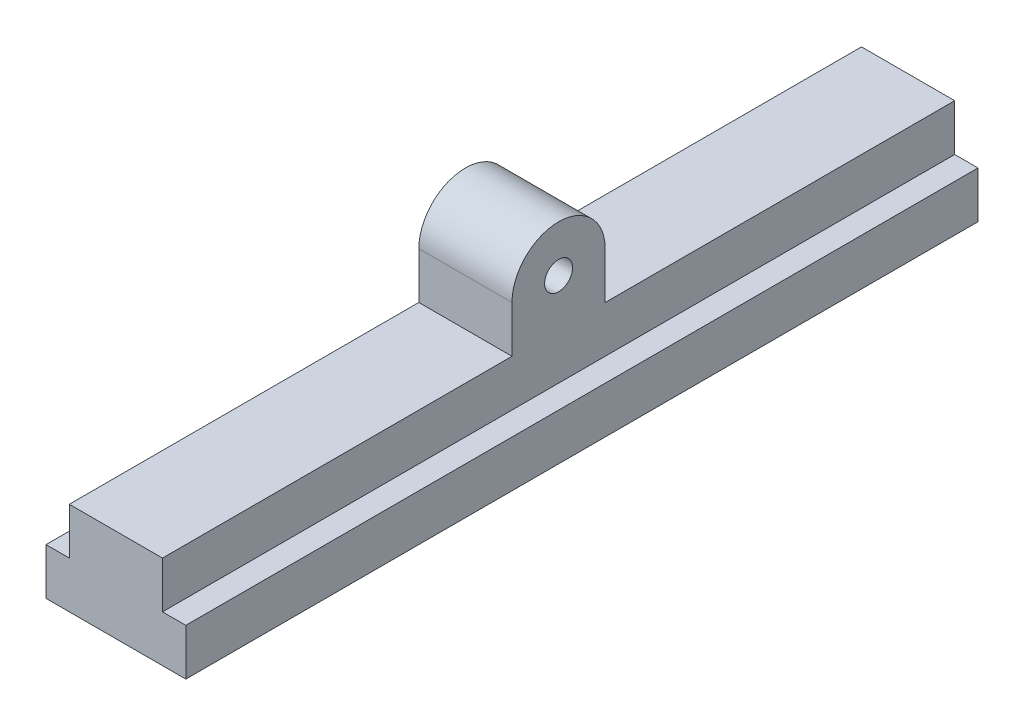
ISO-10303-21;
HEADER;
FILE_DESCRIPTION(('STEP AP214'),'2;1');
FILE_NAME('part.step','',(''),(''),'','','');
FILE_SCHEMA(('AUTOMOTIVE_DESIGN { 1 0 10303 214 1 1 1 1 }'));
ENDSEC;
DATA;
#1=APPLICATION_CONTEXT('core data for automotive mechanical design processes');
#2=APPLICATION_PROTOCOL_DEFINITION('international standard','automotive_design',2000,#1);
#3=PRODUCT_CONTEXT('',#1,'mechanical');
#4=PRODUCT('Part','Part','',(#3));
#5=PRODUCT_RELATED_PRODUCT_CATEGORY('part','',(#4));
#6=PRODUCT_DEFINITION_FORMATION('','',#4);
#7=PRODUCT_DEFINITION_CONTEXT('part definition',#1,'design');
#8=PRODUCT_DEFINITION('design','',#6,#7);
#9=PRODUCT_DEFINITION_SHAPE('','',#8);
#10=(LENGTH_UNIT() NAMED_UNIT(*) SI_UNIT(.MILLI.,.METRE.));
#11=(NAMED_UNIT(*) PLANE_ANGLE_UNIT() SI_UNIT($,.RADIAN.));
#12=(NAMED_UNIT(*) SI_UNIT($,.STERADIAN.) SOLID_ANGLE_UNIT());
#13=UNCERTAINTY_MEASURE_WITH_UNIT(LENGTH_MEASURE(1.E-05),#10,'distance_accuracy_value','');
#14=(GEOMETRIC_REPRESENTATION_CONTEXT(3) GLOBAL_UNCERTAINTY_ASSIGNED_CONTEXT((#13)) GLOBAL_UNIT_ASSIGNED_CONTEXT((#10,
#11,#12)) REPRESENTATION_CONTEXT('',''));
#15=CARTESIAN_POINT('',(0.,0.,0.));
#16=DIRECTION('',(0.,0.,1.));
#17=DIRECTION('',(1.,0.,0.));
#18=AXIS2_PLACEMENT_3D('',#15,#16,#17);
#19=CARTESIAN_POINT('',(-0.0130452574129527,8.13399626442955,240.));
#20=DIRECTION('',(0.,-1.,0.));
#21=DIRECTION('',(0.,0.,-1.));
#22=AXIS2_PLACEMENT_3D('',#19,#20,#21);
#23=PLANE('',#22);
#24=DIRECTION('',(1.,0.,0.));
#25=VECTOR('',#24,1.);
#26=CARTESIAN_POINT('',(-0.0130452574129448,8.13399626442955,165.));
#27=LINE('',#26,#25);
#28=CARTESIAN_POINT('',(-0.0130452574129448,8.13399626442955,165.));
#29=VERTEX_POINT('',#28);
#30=CARTESIAN_POINT('',(19.986954742587,8.13399626442955,165.));
#31=VERTEX_POINT('',#30);
#32=EDGE_CURVE('E159',#29,#31,#27,.T.);
#33=ORIENTED_EDGE('',*,*,#32,.F.);
#34=DIRECTION('',(0.,0.,-1.));
#35=VECTOR('',#34,1.);
#36=CARTESIAN_POINT('',(-0.0130452574129527,8.13399626442955,240.));
#37=LINE('',#36,#35);
#38=CARTESIAN_POINT('',(-0.0130452574129527,8.13399626442955,240.));
#39=VERTEX_POINT('',#38);
#40=EDGE_CURVE('E146',#39,#29,#37,.T.);
#41=ORIENTED_EDGE('',*,*,#40,.F.);
#42=DIRECTION('',(-1.,0.,0.));
#43=VECTOR('',#42,1.);
#44=CARTESIAN_POINT('',(-0.0130452574129527,8.13399626442955,240.));
#45=LINE('',#44,#43);
#46=CARTESIAN_POINT('',(19.986954742587,8.13399626442955,240.));
#47=VERTEX_POINT('',#46);
#48=EDGE_CURVE('E209',#47,#39,#45,.T.);
#49=ORIENTED_EDGE('',*,*,#48,.F.);
#50=DIRECTION('',(0.,0.,-1.));
#51=VECTOR('',#50,1.);
#52=CARTESIAN_POINT('',(19.986954742587,8.13399626442955,240.));
#53=LINE('',#52,#51);
#54=EDGE_CURVE('E234',#47,#31,#53,.T.);
#55=ORIENTED_EDGE('',*,*,#54,.T.);
#56=EDGE_LOOP('',(#33,#41,#49,#55));
#57=FACE_BOUND('',#56,.T.);
#58=ADVANCED_FACE('F47',(#57),#23,.F.);
#59=CARTESIAN_POINT('',(24.986954742587,-1.86600373557045,240.));
#60=DIRECTION('',(-1.,0.,0.));
#61=DIRECTION('',(0.,0.,1.));
#62=AXIS2_PLACEMENT_3D('',#59,#60,#61);
#63=PLANE('',#62);
#64=DIRECTION('',(0.,0.,-1.));
#65=VECTOR('',#64,1.);
#66=CARTESIAN_POINT('',(24.986954742587,-11.8660037355704,240.));
#67=LINE('',#66,#65);
#68=CARTESIAN_POINT('',(24.986954742587,-11.8660037355704,240.));
#69=VERTEX_POINT('',#68);
#70=CARTESIAN_POINT('',(24.986954742587,-11.8660037355704,70.));
#71=VERTEX_POINT('',#70);
#72=EDGE_CURVE('E219',#69,#71,#67,.T.);
#73=ORIENTED_EDGE('',*,*,#72,.T.);
#74=DIRECTION('',(0.,-1.,0.));
#75=VECTOR('',#74,1.);
#76=CARTESIAN_POINT('',(24.986954742587,48.1339962644296,70.));
#77=LINE('',#76,#75);
#78=CARTESIAN_POINT('',(24.986954742587,-1.86600373557044,70.));
#79=VERTEX_POINT('',#78);
#80=EDGE_CURVE('E70',#79,#71,#77,.T.);
#81=ORIENTED_EDGE('',*,*,#80,.F.);
#82=DIRECTION('',(0.,0.,-1.));
#83=VECTOR('',#82,1.);
#84=CARTESIAN_POINT('',(24.986954742587,-1.86600373557045,240.));
#85=LINE('',#84,#83);
#86=CARTESIAN_POINT('',(24.986954742587,-1.86600373557045,240.));
#87=VERTEX_POINT('',#86);
#88=EDGE_CURVE('E11',#87,#79,#85,.T.);
#89=ORIENTED_EDGE('',*,*,#88,.F.);
#90=DIRECTION('',(0.,1.,0.));
#91=VECTOR('',#90,1.);
#92=CARTESIAN_POINT('',(24.986954742587,-1.86600373557045,240.));
#93=LINE('',#92,#91);
#94=EDGE_CURVE('E202',#69,#87,#93,.T.);
#95=ORIENTED_EDGE('',*,*,#94,.F.);
#96=EDGE_LOOP('',(#73,#81,#89,#95));
#97=FACE_BOUND('',#96,.T.);
#98=ADVANCED_FACE('F49',(#97),#63,.F.);
#99=CARTESIAN_POINT('',(19.986954742587,-1.86600373557045,240.));
#100=DIRECTION('',(0.,-1.,0.));
#101=DIRECTION('',(0.,0.,-1.));
#102=AXIS2_PLACEMENT_3D('',#99,#100,#101);
#103=PLANE('',#102);
#104=ORIENTED_EDGE('',*,*,#88,.T.);
#105=DIRECTION('',(-1.,0.,0.));
#106=VECTOR('',#105,1.);
#107=CARTESIAN_POINT('',(19.986954742587,-1.86600373557045,70.));
#108=LINE('',#107,#106);
#109=CARTESIAN_POINT('',(19.986954742587,-1.86600373557045,70.));
#110=VERTEX_POINT('',#109);
#111=EDGE_CURVE('E199',#79,#110,#108,.T.);
#112=ORIENTED_EDGE('',*,*,#111,.T.);
#113=DIRECTION('',(0.,0.,-1.));
#114=VECTOR('',#113,1.);
#115=CARTESIAN_POINT('',(19.986954742587,-1.86600373557045,240.));
#116=LINE('',#115,#114);
#117=CARTESIAN_POINT('',(19.986954742587,-1.86600373557045,240.));
#118=VERTEX_POINT('',#117);
#119=EDGE_CURVE('E55',#118,#110,#116,.T.);
#120=ORIENTED_EDGE('',*,*,#119,.F.);
#121=DIRECTION('',(-1.,0.,0.));
#122=VECTOR('',#121,1.);
#123=CARTESIAN_POINT('',(19.986954742587,-1.86600373557045,240.));
#124=LINE('',#123,#122);
#125=EDGE_CURVE('E205',#87,#118,#124,.T.);
#126=ORIENTED_EDGE('',*,*,#125,.F.);
#127=EDGE_LOOP('',(#104,#112,#120,#126));
#128=FACE_BOUND('',#127,.T.);
#129=ADVANCED_FACE('F245',(#128),#103,.F.);
#130=CARTESIAN_POINT('',(19.986954742587,8.13399626442955,240.));
#131=DIRECTION('',(-1.,0.,0.));
#132=DIRECTION('',(0.,0.,1.));
#133=AXIS2_PLACEMENT_3D('',#130,#131,#132);
#134=PLANE('',#133);
#135=ORIENTED_EDGE('',*,*,#119,.T.);
#136=DIRECTION('',(0.,1.,0.));
#137=VECTOR('',#136,1.);
#138=CARTESIAN_POINT('',(19.986954742587,8.13399626442955,70.));
#139=LINE('',#138,#137);
#140=CARTESIAN_POINT('',(19.986954742587,8.13399626442955,70.));
#141=VERTEX_POINT('',#140);
#142=EDGE_CURVE('E196',#110,#141,#139,.T.);
#143=ORIENTED_EDGE('',*,*,#142,.T.);
#144=CARTESIAN_POINT('',(19.986954742587,8.13399626442955,145.));
#145=VERTEX_POINT('',#144);
#146=EDGE_CURVE('E233',#145,#141,#53,.T.);
#147=ORIENTED_EDGE('',*,*,#146,.F.);
#148=DIRECTION('',(0.,1.,0.));
#149=VECTOR('',#148,1.);
#150=CARTESIAN_POINT('',(19.986954742587,0.,145.));
#151=LINE('',#150,#149);
#152=CARTESIAN_POINT('',(19.986954742587,18.1339962644295,145.));
#153=VERTEX_POINT('',#152);
#154=EDGE_CURVE('E62',#145,#153,#151,.T.);
#155=ORIENTED_EDGE('',*,*,#154,.T.);
#156=CARTESIAN_POINT('',(19.986954742587,18.1339962644295,155.));
#157=DIRECTION('',(1.,0.,0.));
#158=DIRECTION('',(0.,0.,-1.));
#159=AXIS2_PLACEMENT_3D('',#156,#157,#158);
#160=CIRCLE('',#159,9.99999999999998);
#161=CARTESIAN_POINT('',(19.986954742587,18.1339962644296,165.));
#162=VERTEX_POINT('',#161);
#163=EDGE_CURVE('E173',#153,#162,#160,.T.);
#164=ORIENTED_EDGE('',*,*,#163,.T.);
#165=DIRECTION('',(0.,1.,0.));
#166=VECTOR('',#165,1.);
#167=CARTESIAN_POINT('',(19.986954742587,0.,165.));
#168=LINE('',#167,#166);
#169=EDGE_CURVE('E155',#31,#162,#168,.T.);
#170=ORIENTED_EDGE('',*,*,#169,.F.);
#171=ORIENTED_EDGE('',*,*,#54,.F.);
#172=DIRECTION('',(0.,1.,0.));
#173=VECTOR('',#172,1.);
#174=CARTESIAN_POINT('',(19.986954742587,8.13399626442955,240.));
#175=LINE('',#174,#173);
#176=EDGE_CURVE('E207',#118,#47,#175,.T.);
#177=ORIENTED_EDGE('',*,*,#176,.F.);
#178=EDGE_LOOP('',(#135,#143,#147,#155,#164,#170,#171,#177));
#179=FACE_BOUND('',#178,.T.);
#180=CARTESIAN_POINT('',(19.986954742587,18.1339962644295,155.));
#181=DIRECTION('',(1.,0.,0.));
#182=DIRECTION('',(0.,0.,-1.));
#183=AXIS2_PLACEMENT_3D('',#180,#181,#182);
#184=CIRCLE('',#183,2.99999999999999);
#185=CARTESIAN_POINT('',(19.986954742587,18.1339962644295,152.));
#186=VERTEX_POINT('',#185);
#187=EDGE_CURVE('E164',#186,#186,#184,.T.);
#188=ORIENTED_EDGE('',*,*,#187,.F.);
#189=EDGE_LOOP('',(#188));
#190=FACE_BOUND('',#189,.T.);
#191=ADVANCED_FACE('F240',(#179,#190),#134,.F.);
#192=CARTESIAN_POINT('',(-0.0130452574129448,8.13399626442955,145.));
#193=VERTEX_POINT('',#192);
#194=CARTESIAN_POINT('',(-0.0130452574129527,8.13399626442955,70.));
#195=VERTEX_POINT('',#194);
#196=EDGE_CURVE('E231',#193,#195,#37,.T.);
#197=ORIENTED_EDGE('',*,*,#196,.F.);
#198=DIRECTION('',(1.,0.,0.));
#199=VECTOR('',#198,1.);
#200=CARTESIAN_POINT('',(-0.0130452574129448,8.13399626442955,145.));
#201=LINE('',#200,#199);
#202=EDGE_CURVE('E179',#193,#145,#201,.T.);
#203=ORIENTED_EDGE('',*,*,#202,.T.);
#204=ORIENTED_EDGE('',*,*,#146,.T.);
#205=DIRECTION('',(-1.,0.,0.));
#206=VECTOR('',#205,1.);
#207=CARTESIAN_POINT('',(-0.0130452574129527,8.13399626442955,70.));
#208=LINE('',#207,#206);
#209=EDGE_CURVE('E193',#141,#195,#208,.T.);
#210=ORIENTED_EDGE('',*,*,#209,.T.);
#211=EDGE_LOOP('',(#197,#203,#204,#210));
#212=FACE_BOUND('',#211,.T.);
#213=ADVANCED_FACE('F267',(#212),#23,.F.);
#214=CARTESIAN_POINT('',(-0.0130452574129527,-1.86600373557045,240.));
#215=DIRECTION('',(1.,0.,0.));
#216=DIRECTION('',(0.,0.,-1.));
#217=AXIS2_PLACEMENT_3D('',#214,#215,#216);
#218=PLANE('',#217);
#219=ORIENTED_EDGE('',*,*,#40,.T.);
#220=DIRECTION('',(0.,1.,0.));
#221=VECTOR('',#220,1.);
#222=CARTESIAN_POINT('',(-0.0130452574129448,0.,165.));
#223=LINE('',#222,#221);
#224=CARTESIAN_POINT('',(-0.0130452574129448,18.1339962644296,165.));
#225=VERTEX_POINT('',#224);
#226=EDGE_CURVE('E136',#29,#225,#223,.T.);
#227=ORIENTED_EDGE('',*,*,#226,.T.);
#228=CARTESIAN_POINT('',(-0.0130452574129448,18.1339962644295,155.));
#229=DIRECTION('',(1.,0.,0.));
#230=DIRECTION('',(0.,0.,-1.));
#231=AXIS2_PLACEMENT_3D('',#228,#229,#230);
#232=CIRCLE('',#231,9.99999999999998);
#233=CARTESIAN_POINT('',(-0.0130452574129448,18.1339962644295,145.));
#234=VERTEX_POINT('',#233);
#235=EDGE_CURVE('E142',#234,#225,#232,.T.);
#236=ORIENTED_EDGE('',*,*,#235,.F.);
#237=DIRECTION('',(0.,1.,0.));
#238=VECTOR('',#237,1.);
#239=CARTESIAN_POINT('',(-0.0130452574129448,0.,145.));
#240=LINE('',#239,#238);
#241=EDGE_CURVE('E149',#193,#234,#240,.T.);
#242=ORIENTED_EDGE('',*,*,#241,.F.);
#243=ORIENTED_EDGE('',*,*,#196,.T.);
#244=DIRECTION('',(0.,-1.,0.));
#245=VECTOR('',#244,1.);
#246=CARTESIAN_POINT('',(-0.0130452574129527,-1.86600373557045,70.));
#247=LINE('',#246,#245);
#248=CARTESIAN_POINT('',(-0.0130452574129527,-1.86600373557045,70.));
#249=VERTEX_POINT('',#248);
#250=EDGE_CURVE('E190',#195,#249,#247,.T.);
#251=ORIENTED_EDGE('',*,*,#250,.T.);
#252=DIRECTION('',(0.,0.,-1.));
#253=VECTOR('',#252,1.);
#254=CARTESIAN_POINT('',(-0.0130452574129527,-1.86600373557045,240.));
#255=LINE('',#254,#253);
#256=CARTESIAN_POINT('',(-0.0130452574129527,-1.86600373557045,240.));
#257=VERTEX_POINT('',#256);
#258=EDGE_CURVE('E228',#257,#249,#255,.T.);
#259=ORIENTED_EDGE('',*,*,#258,.F.);
#260=DIRECTION('',(0.,-1.,0.));
#261=VECTOR('',#260,1.);
#262=CARTESIAN_POINT('',(-0.0130452574129527,-1.86600373557045,240.));
#263=LINE('',#262,#261);
#264=EDGE_CURVE('E211',#39,#257,#263,.T.);
#265=ORIENTED_EDGE('',*,*,#264,.F.);
#266=EDGE_LOOP('',(#219,#227,#236,#242,#243,#251,#259,#265));
#267=FACE_BOUND('',#266,.T.);
#268=CARTESIAN_POINT('',(-0.0130452574129448,18.1339962644295,155.));
#269=DIRECTION('',(1.,0.,0.));
#270=DIRECTION('',(0.,0.,-1.));
#271=AXIS2_PLACEMENT_3D('',#268,#269,#270);
#272=CIRCLE('',#271,2.99999999999999);
#273=CARTESIAN_POINT('',(-0.0130452574129448,18.1339962644295,152.));
#274=VERTEX_POINT('',#273);
#275=EDGE_CURVE('E160',#274,#274,#272,.T.);
#276=ORIENTED_EDGE('',*,*,#275,.T.);
#277=EDGE_LOOP('',(#276));
#278=FACE_BOUND('',#277,.T.);
#279=ADVANCED_FACE('F138',(#267,#278),#218,.F.);
#280=CARTESIAN_POINT('',(-5.01304525741295,-1.86600373557045,240.));
#281=DIRECTION('',(0.,-1.,0.));
#282=DIRECTION('',(0.,0.,-1.));
#283=AXIS2_PLACEMENT_3D('',#280,#281,#282);
#284=PLANE('',#283);
#285=ORIENTED_EDGE('',*,*,#258,.T.);
#286=DIRECTION('',(-1.,0.,0.));
#287=VECTOR('',#286,1.);
#288=CARTESIAN_POINT('',(-5.01304525741295,-1.86600373557045,70.));
#289=LINE('',#288,#287);
#290=CARTESIAN_POINT('',(-5.01304525741297,-1.86600373557044,70.));
#291=VERTEX_POINT('',#290);
#292=EDGE_CURVE('E186',#249,#291,#289,.T.);
#293=ORIENTED_EDGE('',*,*,#292,.T.);
#294=DIRECTION('',(0.,0.,-1.));
#295=VECTOR('',#294,1.);
#296=CARTESIAN_POINT('',(-5.01304525741295,-1.86600373557045,240.));
#297=LINE('',#296,#295);
#298=CARTESIAN_POINT('',(-5.01304525741295,-1.86600373557045,240.));
#299=VERTEX_POINT('',#298);
#300=EDGE_CURVE('E225',#299,#291,#297,.T.);
#301=ORIENTED_EDGE('',*,*,#300,.F.);
#302=DIRECTION('',(-1.,0.,0.));
#303=VECTOR('',#302,1.);
#304=CARTESIAN_POINT('',(-5.01304525741295,-1.86600373557045,240.));
#305=LINE('',#304,#303);
#306=EDGE_CURVE('E213',#257,#299,#305,.T.);
#307=ORIENTED_EDGE('',*,*,#306,.F.);
#308=EDGE_LOOP('',(#285,#293,#301,#307));
#309=FACE_BOUND('',#308,.T.);
#310=ADVANCED_FACE('F262',(#309),#284,.F.);
#311=CARTESIAN_POINT('',(-5.01304525741295,-11.8660037355704,240.));
#312=DIRECTION('',(1.,0.,0.));
#313=DIRECTION('',(0.,0.,-1.));
#314=AXIS2_PLACEMENT_3D('',#311,#312,#313);
#315=PLANE('',#314);
#316=ORIENTED_EDGE('',*,*,#300,.T.);
#317=DIRECTION('',(0.,-1.,0.));
#318=VECTOR('',#317,1.);
#319=CARTESIAN_POINT('',(-5.01304525741298,48.1339962644296,70.));
#320=LINE('',#319,#318);
#321=CARTESIAN_POINT('',(-5.01304525741297,-11.8660037355704,70.));
#322=VERTEX_POINT('',#321);
#323=EDGE_CURVE('E183',#291,#322,#320,.T.);
#324=ORIENTED_EDGE('',*,*,#323,.T.);
#325=DIRECTION('',(0.,0.,-1.));
#326=VECTOR('',#325,1.);
#327=CARTESIAN_POINT('',(-5.01304525741295,-11.8660037355704,240.));
#328=LINE('',#327,#326);
#329=CARTESIAN_POINT('',(-5.01304525741295,-11.8660037355704,240.));
#330=VERTEX_POINT('',#329);
#331=EDGE_CURVE('E222',#330,#322,#328,.T.);
#332=ORIENTED_EDGE('',*,*,#331,.F.);
#333=DIRECTION('',(0.,-1.,0.));
#334=VECTOR('',#333,1.);
#335=CARTESIAN_POINT('',(-5.01304525741295,-11.8660037355704,240.));
#336=LINE('',#335,#334);
#337=EDGE_CURVE('E215',#299,#330,#336,.T.);
#338=ORIENTED_EDGE('',*,*,#337,.F.);
#339=EDGE_LOOP('',(#316,#324,#332,#338));
#340=FACE_BOUND('',#339,.T.);
#341=ADVANCED_FACE('F257',(#340),#315,.F.);
#342=CARTESIAN_POINT('',(24.986954742587,-11.8660037355704,240.));
#343=DIRECTION('',(0.,1.,0.));
#344=DIRECTION('',(-1.,0.,0.));
#345=AXIS2_PLACEMENT_3D('',#342,#343,#344);
#346=PLANE('',#345);
#347=ORIENTED_EDGE('',*,*,#331,.T.);
#348=DIRECTION('',(-1.,0.,0.));
#349=VECTOR('',#348,1.);
#350=CARTESIAN_POINT('',(-5.01304525741297,-11.8660037355704,70.));
#351=LINE('',#350,#349);
#352=EDGE_CURVE('E178',#71,#322,#351,.T.);
#353=ORIENTED_EDGE('',*,*,#352,.F.);
#354=ORIENTED_EDGE('',*,*,#72,.F.);
#355=DIRECTION('',(1.,0.,0.));
#356=VECTOR('',#355,1.);
#357=CARTESIAN_POINT('',(24.986954742587,-11.8660037355704,240.));
#358=LINE('',#357,#356);
#359=EDGE_CURVE('E217',#330,#69,#358,.T.);
#360=ORIENTED_EDGE('',*,*,#359,.F.);
#361=EDGE_LOOP('',(#347,#353,#354,#360));
#362=FACE_BOUND('',#361,.T.);
#363=ADVANCED_FACE('F254',(#362),#346,.F.);
#364=CARTESIAN_POINT('',(0.,0.,240.));
#365=DIRECTION('',(0.,0.,-1.));
#366=DIRECTION('',(-1.,0.,0.));
#367=AXIS2_PLACEMENT_3D('',#364,#365,#366);
#368=PLANE('',#367);
#369=ORIENTED_EDGE('',*,*,#94,.T.);
#370=ORIENTED_EDGE('',*,*,#125,.T.);
#371=ORIENTED_EDGE('',*,*,#176,.T.);
#372=ORIENTED_EDGE('',*,*,#48,.T.);
#373=ORIENTED_EDGE('',*,*,#264,.T.);
#374=ORIENTED_EDGE('',*,*,#306,.T.);
#375=ORIENTED_EDGE('',*,*,#337,.T.);
#376=ORIENTED_EDGE('',*,*,#359,.T.);
#377=EDGE_LOOP('',(#369,#370,#371,#372,#373,#374,#375,#376));
#378=FACE_BOUND('',#377,.T.);
#379=ADVANCED_FACE('F271',(#378),#368,.F.);
#380=CARTESIAN_POINT('',(-5.01304525741298,48.1339962644296,70.));
#381=DIRECTION('',(0.,0.,1.));
#382=DIRECTION('',(1.,0.,0.));
#383=AXIS2_PLACEMENT_3D('',#380,#381,#382);
#384=PLANE('',#383);
#385=ORIENTED_EDGE('',*,*,#80,.T.);
#386=ORIENTED_EDGE('',*,*,#352,.T.);
#387=ORIENTED_EDGE('',*,*,#323,.F.);
#388=ORIENTED_EDGE('',*,*,#292,.F.);
#389=ORIENTED_EDGE('',*,*,#250,.F.);
#390=ORIENTED_EDGE('',*,*,#209,.F.);
#391=ORIENTED_EDGE('',*,*,#142,.F.);
#392=ORIENTED_EDGE('',*,*,#111,.F.);
#393=EDGE_LOOP('',(#385,#386,#387,#388,#389,#390,#391,#392));
#394=FACE_BOUND('',#393,.T.);
#395=ADVANCED_FACE('F247',(#394),#384,.F.);
#396=CARTESIAN_POINT('',(-0.0130452574129448,18.1339962644295,155.));
#397=DIRECTION('',(1.,0.,0.));
#398=DIRECTION('',(0.,0.,-1.));
#399=AXIS2_PLACEMENT_3D('',#396,#397,#398);
#400=CYLINDRICAL_SURFACE('',#399,9.99999999999998);
#401=ORIENTED_EDGE('',*,*,#163,.F.);
#402=DIRECTION('',(1.,0.,0.));
#403=VECTOR('',#402,1.);
#404=CARTESIAN_POINT('',(-0.0130452574129448,18.1339962644295,145.));
#405=LINE('',#404,#403);
#406=EDGE_CURVE('E163',#234,#153,#405,.T.);
#407=ORIENTED_EDGE('',*,*,#406,.F.);
#408=ORIENTED_EDGE('',*,*,#235,.T.);
#409=DIRECTION('',(1.,0.,0.));
#410=VECTOR('',#409,1.);
#411=CARTESIAN_POINT('',(-0.0130452574129448,18.1339962644296,165.));
#412=LINE('',#411,#410);
#413=EDGE_CURVE('E152',#225,#162,#412,.T.);
#414=ORIENTED_EDGE('',*,*,#413,.T.);
#415=EDGE_LOOP('',(#401,#407,#408,#414));
#416=FACE_BOUND('',#415,.T.);
#417=ADVANCED_FACE('F162',(#416),#400,.T.);
#418=CARTESIAN_POINT('',(-0.0130452574129448,0.,145.));
#419=DIRECTION('',(0.,0.,-1.));
#420=DIRECTION('',(-1.,0.,0.));
#421=AXIS2_PLACEMENT_3D('',#418,#419,#420);
#422=PLANE('',#421);
#423=ORIENTED_EDGE('',*,*,#154,.F.);
#424=ORIENTED_EDGE('',*,*,#202,.F.);
#425=ORIENTED_EDGE('',*,*,#241,.T.);
#426=ORIENTED_EDGE('',*,*,#406,.T.);
#427=EDGE_LOOP('',(#423,#424,#425,#426));
#428=FACE_BOUND('',#427,.T.);
#429=ADVANCED_FACE('F333',(#428),#422,.T.);
#430=CARTESIAN_POINT('',(-0.0130452574129448,0.,165.));
#431=DIRECTION('',(0.,0.,-1.));
#432=DIRECTION('',(-1.,0.,0.));
#433=AXIS2_PLACEMENT_3D('',#430,#431,#432);
#434=PLANE('',#433);
#435=ORIENTED_EDGE('',*,*,#169,.T.);
#436=ORIENTED_EDGE('',*,*,#413,.F.);
#437=ORIENTED_EDGE('',*,*,#226,.F.);
#438=ORIENTED_EDGE('',*,*,#32,.T.);
#439=EDGE_LOOP('',(#435,#436,#437,#438));
#440=FACE_BOUND('',#439,.T.);
#441=ADVANCED_FACE('F153',(#440),#434,.F.);
#442=CARTESIAN_POINT('',(-0.0130452574129448,18.1339962644295,155.));
#443=DIRECTION('',(1.,0.,0.));
#444=DIRECTION('',(0.,0.,-1.));
#445=AXIS2_PLACEMENT_3D('',#442,#443,#444);
#446=CYLINDRICAL_SURFACE('',#445,2.99999999999999);
#447=ORIENTED_EDGE('',*,*,#275,.F.);
#448=EDGE_LOOP('',(#447));
#449=FACE_BOUND('',#448,.T.);
#450=ORIENTED_EDGE('',*,*,#187,.T.);
#451=EDGE_LOOP('',(#450));
#452=FACE_BOUND('',#451,.T.);
#453=ADVANCED_FACE('F348',(#449,#452),#446,.F.);
#454=CLOSED_SHELL('',(#58,#98,#129,#191,#213,#279,#310,#341,#363,#379,#395,#417,#429,#441,#453));
#455=MANIFOLD_SOLID_BREP('B2',#454);
#456=ADVANCED_BREP_SHAPE_REPRESENTATION('',(#18,#455),#14);
#457=SHAPE_DEFINITION_REPRESENTATION(#9,#456);
ENDSEC;
END-ISO-10303-21;
